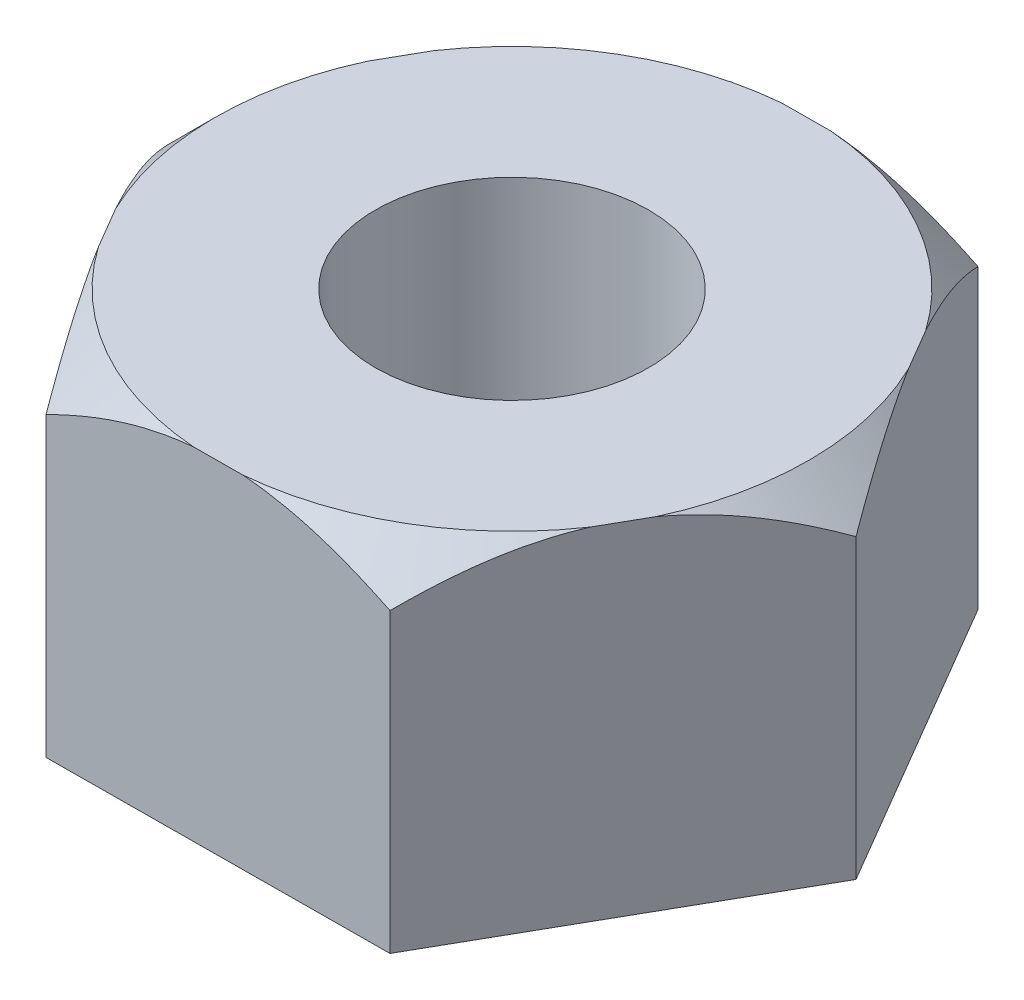
ISO-10303-21;
HEADER;
FILE_DESCRIPTION(('STEP AP214'),'2;1');
FILE_NAME('part.step','',(''),(''),'','','');
FILE_SCHEMA(('AUTOMOTIVE_DESIGN { 1 0 10303 214 1 1 1 1 }'));
ENDSEC;
DATA;
#1=APPLICATION_CONTEXT('core data for automotive mechanical design processes');
#2=APPLICATION_PROTOCOL_DEFINITION('international standard','automotive_design',2000,#1);
#3=PRODUCT_CONTEXT('',#1,'mechanical');
#4=PRODUCT('Part','Part','',(#3));
#5=PRODUCT_RELATED_PRODUCT_CATEGORY('part','',(#4));
#6=PRODUCT_DEFINITION_FORMATION('','',#4);
#7=PRODUCT_DEFINITION_CONTEXT('part definition',#1,'design');
#8=PRODUCT_DEFINITION('design','',#6,#7);
#9=PRODUCT_DEFINITION_SHAPE('','',#8);
#10=(LENGTH_UNIT() NAMED_UNIT(*) SI_UNIT(.MILLI.,.METRE.));
#11=(NAMED_UNIT(*) PLANE_ANGLE_UNIT() SI_UNIT($,.RADIAN.));
#12=(NAMED_UNIT(*) SI_UNIT($,.STERADIAN.) SOLID_ANGLE_UNIT());
#13=UNCERTAINTY_MEASURE_WITH_UNIT(LENGTH_MEASURE(1.E-05),#10,'distance_accuracy_value','');
#14=(GEOMETRIC_REPRESENTATION_CONTEXT(3) GLOBAL_UNCERTAINTY_ASSIGNED_CONTEXT((#13)) GLOBAL_UNIT_ASSIGNED_CONTEXT((#10,
#11,#12)) REPRESENTATION_CONTEXT('',''));
#15=CARTESIAN_POINT('',(0.,0.,0.));
#16=DIRECTION('',(0.,0.,1.));
#17=DIRECTION('',(1.,0.,0.));
#18=AXIS2_PLACEMENT_3D('',#15,#16,#17);
#19=CARTESIAN_POINT('',(0.,5.,0.));
#20=DIRECTION('',(0.,1.,0.));
#21=DIRECTION('',(0.,0.,1.));
#22=AXIS2_PLACEMENT_3D('',#19,#20,#21);
#23=PLANE('',#22);
#24=CARTESIAN_POINT('',(0.,5.,0.));
#25=DIRECTION('',(0.,1.,0.));
#26=DIRECTION('',(0.,0.,1.));
#27=AXIS2_PLACEMENT_3D('',#24,#25,#26);
#28=CIRCLE('',#27,2.);
#29=CARTESIAN_POINT('',(0.,5.,2.));
#30=VERTEX_POINT('',#29);
#31=EDGE_CURVE('E178',#30,#30,#28,.T.);
#32=ORIENTED_EDGE('',*,*,#31,.F.);
#33=EDGE_LOOP('',(#32));
#34=FACE_BOUND('',#33,.T.);
#35=DIRECTION('',(0.999978107754049,0.,-0.00661694889134233));
#36=VECTOR('',#35,1.);
#37=CARTESIAN_POINT('',(-2.47134714354739,5.,4.34666975330816));
#38=LINE('',#37,#36);
#39=CARTESIAN_POINT('',(-0.324990146446854,5.,4.33246710782796));
#40=VERTEX_POINT('',#39);
#41=CARTESIAN_POINT('',(0.382295859352073,5.,4.32778693001643));
#42=VERTEX_POINT('',#41);
#43=EDGE_CURVE('E146',#40,#42,#38,.T.);
#44=ORIENTED_EDGE('',*,*,#43,.T.);
#45=CARTESIAN_POINT('',(0.,5.,0.));
#46=DIRECTION('',(0.,1.,0.));
#47=DIRECTION('',(0.,0.,1.));
#48=AXIS2_PLACEMENT_3D('',#45,#46,#47);
#49=CIRCLE('',#48,4.34463920661989);
#50=CARTESIAN_POINT('',(3.58953150321608,5.,2.44768327671659));
#51=VERTEX_POINT('',#50);
#52=EDGE_CURVE('E131',#42,#51,#49,.T.);
#53=ORIENTED_EDGE('',*,*,#52,.T.);
#54=DIRECTION('',(0.494258608041579,0.,-0.869314918988971));
#55=VECTOR('',#54,1.);
#56=CARTESIAN_POINT('',(2.52865285645261,5.,4.31358428453623));
#57=LINE('',#56,#55);
#58=CARTESIAN_POINT('',(3.93912135323653,5.,1.83281553904771));
#59=VERTEX_POINT('',#58);
#60=EDGE_CURVE('E153',#51,#59,#57,.T.);
#61=ORIENTED_EDGE('',*,*,#60,.T.);
#62=CARTESIAN_POINT('',(3.91452164966294,5.,-1.88478383111138));
#63=VERTEX_POINT('',#62);
#64=EDGE_CURVE('E139',#59,#63,#49,.T.);
#65=ORIENTED_EDGE('',*,*,#64,.T.);
#66=DIRECTION('',(-0.50571949971247,0.,-0.862697970097628));
#67=VECTOR('',#66,1.);
#68=CARTESIAN_POINT('',(5.,5.,-0.0330854687719316));
#69=LINE('',#68,#67);
#70=CARTESIAN_POINT('',(3.55682549388446,5.,-2.49497139096871));
#71=VERTEX_POINT('',#70);
#72=EDGE_CURVE('E156',#63,#71,#69,.T.);
#73=ORIENTED_EDGE('',*,*,#72,.T.);
#74=CARTESIAN_POINT('',(0.324990146446878,5.,-4.33246710782796));
#75=VERTEX_POINT('',#74);
#76=EDGE_CURVE('E422',#71,#75,#49,.T.);
#77=ORIENTED_EDGE('',*,*,#76,.T.);
#78=DIRECTION('',(-0.999978107754049,0.,0.00661694889134233));
#79=VECTOR('',#78,1.);
#80=CARTESIAN_POINT('',(2.47134714354739,5.,-4.34666975330816));
#81=LINE('',#80,#79);
#82=CARTESIAN_POINT('',(-0.382295859352097,5.,-4.32778693001643));
#83=VERTEX_POINT('',#82);
#84=EDGE_CURVE('E166',#75,#83,#81,.T.);
#85=ORIENTED_EDGE('',*,*,#84,.T.);
#86=CARTESIAN_POINT('',(-3.58953150321606,5.,-2.44768327671662));
#87=VERTEX_POINT('',#86);
#88=EDGE_CURVE('E427',#83,#87,#49,.T.);
#89=ORIENTED_EDGE('',*,*,#88,.T.);
#90=DIRECTION('',(-0.494258608041579,0.,0.869314918988971));
#91=VECTOR('',#90,1.);
#92=CARTESIAN_POINT('',(-2.52865285645261,5.,-4.31358428453623));
#93=LINE('',#92,#91);
#94=CARTESIAN_POINT('',(-3.93912135323655,5.,-1.83281553904768));
#95=VERTEX_POINT('',#94);
#96=EDGE_CURVE('E169',#87,#95,#93,.T.);
#97=ORIENTED_EDGE('',*,*,#96,.T.);
#98=CARTESIAN_POINT('',(-3.91452164966295,5.,1.88478383111136));
#99=VERTEX_POINT('',#98);
#100=EDGE_CURVE('E431',#95,#99,#49,.T.);
#101=ORIENTED_EDGE('',*,*,#100,.T.);
#102=DIRECTION('',(0.50571949971247,0.,0.862697970097628));
#103=VECTOR('',#102,1.);
#104=CARTESIAN_POINT('',(-5.,5.,0.0330854687719312));
#105=LINE('',#104,#103);
#106=CARTESIAN_POINT('',(-3.55682549388444,5.,2.49497139096873));
#107=VERTEX_POINT('',#106);
#108=EDGE_CURVE('E172',#99,#107,#105,.T.);
#109=ORIENTED_EDGE('',*,*,#108,.T.);
#110=EDGE_CURVE('E141',#107,#40,#49,.T.);
#111=ORIENTED_EDGE('',*,*,#110,.T.);
#112=EDGE_LOOP('',(#44,#53,#61,#65,#73,#77,#85,#89,#97,#101,#109,#111));
#113=FACE_BOUND('',#112,.T.);
#114=ADVANCED_FACE('F38',(#34,#113),#23,.T.);
#115=CARTESIAN_POINT('',(-2.47134714354739,5.,4.34666975330816));
#116=DIRECTION('',(-0.00661694889134233,0.,-0.999978107754049));
#117=DIRECTION('',(-0.99997810775405,0.,0.00661694889134233));
#118=AXIS2_PLACEMENT_3D('',#115,#116,#117);
#119=PLANE('',#118);
#120=CARTESIAN_POINT('',(-2.47204714354739,4.34417969858305,4.34667438527379));
#121=CARTESIAN_POINT('',(-2.3860592991126,4.38717713174804,4.34610539564543));
#122=CARTESIAN_POINT('',(-2.29941043206587,4.4288553084804,4.34553203196847));
#123=CARTESIAN_POINT('',(-2.12466089074699,4.50917172835081,4.34437569787002));
#124=CARTESIAN_POINT('',(-2.0365594545984,4.54780831057605,4.34379272240713));
#125=CARTESIAN_POINT('',(-1.76906259243644,4.65888324950996,4.3420226705912));
#126=CARTESIAN_POINT('',(-1.58740219764143,4.72601265143189,4.34082060672739));
#127=CARTESIAN_POINT('',(-1.22106910310286,4.84096836799502,4.33839654629549));
#128=CARTESIAN_POINT('',(-1.03649011129652,4.88908440940011,4.33717516980162));
#129=CARTESIAN_POINT('',(-0.756585902561346,4.94474377625473,4.33532301741017));
#130=CARTESIAN_POINT('',(-0.662872276855587,4.96053699990727,4.33470290556281));
#131=CARTESIAN_POINT('',(-0.474651193440528,4.98626103131718,4.3334574290073));
#132=CARTESIAN_POINT('',(-0.380143856620473,4.99619271598547,4.33283206509909));
#133=CARTESIAN_POINT('',(-0.149869709892191,5.01284314701085,4.33130831948097));
#134=CARTESIAN_POINT('',(-0.0138548383188239,5.01633835366766,4.33040829632378));
#135=CARTESIAN_POINT('',(0.257930051112726,5.0104826537938,4.32860987022939));
#136=CARTESIAN_POINT('',(0.393699966405562,5.00112724296213,4.32771146797087));
#137=CARTESIAN_POINT('',(0.663960100809833,4.9701217742495,4.32592313132344));
#138=CARTESIAN_POINT('',(0.79844871619927,4.94845795691753,4.32503320754651));
#139=CARTESIAN_POINT('',(1.06511452691763,4.89401351447174,4.3232686548759));
#140=CARTESIAN_POINT('',(1.1972918985713,4.8612337413193,4.32239402481546));
#141=CARTESIAN_POINT('',(1.43198337860662,4.79377956373911,4.32084104928871));
#142=CARTESIAN_POINT('',(1.53501613119798,4.76087585671255,4.32015927190504));
#143=CARTESIAN_POINT('',(1.73923113548591,4.68976358572991,4.31880796207561));
#144=CARTESIAN_POINT('',(1.84041332987367,4.6515548577996,4.31813843000908));
#145=CARTESIAN_POINT('',(2.04060862344612,4.57068970077236,4.31681371898232));
#146=CARTESIAN_POINT('',(2.13962741741008,4.52804725384667,4.31615850233922));
#147=CARTESIAN_POINT('',(2.33583046751876,4.43887510636752,4.31486020836175));
#148=CARTESIAN_POINT('',(2.43301580693542,4.39234779531691,4.31421712385928));
#149=CARTESIAN_POINT('',(2.52935285645261,4.34417969858305,4.3135796525706));
#150=B_SPLINE_CURVE_WITH_KNOTS('',3,(#120,#121,#122,#123,#124,#125,#126,#127,#128,#129,#130,
#131,#132,#133,#134,#135,#136,#137,#138,#139,#140,#141,#142,#143,#144,#145,#146,#147,#148,#149),
.UNSPECIFIED.,.F.,.F.,(4,2,2,2,2,2,2,2,2,2,2,2,2,2,4),(0.,0.288404885729802,0.576966182751782,
1.15720621223807,1.72822790550571,2.01317834687957,2.29808614765337,2.70564017288363,
3.11333708731846,3.5214906615511,3.92961296069352,4.25394443535271,4.57828593708831,
4.90163395382304,5.22478453037687),.UNSPECIFIED.);
#151=CARTESIAN_POINT('',(-2.47134714354739,4.34452974299374,4.34666975330816));
#152=VERTEX_POINT('',#151);
#153=EDGE_CURVE('E138',#152,#40,#150,.T.);
#154=ORIENTED_EDGE('',*,*,#153,.F.);
#155=DIRECTION('',(0.,-1.,0.));
#156=VECTOR('',#155,1.);
#157=CARTESIAN_POINT('',(-2.47134714354739,5.,4.34666975330816));
#158=LINE('',#157,#156);
#159=CARTESIAN_POINT('',(-2.47134714354739,0.,4.34666975330816));
#160=VERTEX_POINT('',#159);
#161=EDGE_CURVE('E174',#152,#160,#158,.T.);
#162=ORIENTED_EDGE('',*,*,#161,.T.);
#163=DIRECTION('',(0.999978107754049,0.,-0.00661694889134233));
#164=VECTOR('',#163,1.);
#165=CARTESIAN_POINT('',(-2.47134714354739,0.,4.34666975330816));
#166=LINE('',#165,#164);
#167=CARTESIAN_POINT('',(2.52865285645261,0.,4.31358428453623));
#168=VERTEX_POINT('',#167);
#169=EDGE_CURVE('E175',#160,#168,#166,.T.);
#170=ORIENTED_EDGE('',*,*,#169,.T.);
#171=DIRECTION('',(0.,-1.,0.));
#172=VECTOR('',#171,1.);
#173=CARTESIAN_POINT('',(2.52865285645261,5.,4.31358428453623));
#174=LINE('',#173,#172);
#175=CARTESIAN_POINT('',(2.52865285645261,4.34452974299374,4.31358428453623));
#176=VERTEX_POINT('',#175);
#177=EDGE_CURVE('E148',#176,#168,#174,.T.);
#178=ORIENTED_EDGE('',*,*,#177,.F.);
#179=EDGE_CURVE('E60',#42,#176,#150,.T.);
#180=ORIENTED_EDGE('',*,*,#179,.F.);
#181=ORIENTED_EDGE('',*,*,#43,.F.);
#182=EDGE_LOOP('',(#154,#162,#170,#178,#180,#181));
#183=FACE_BOUND('',#182,.T.);
#184=ADVANCED_FACE('F40',(#183),#119,.F.);
#185=CARTESIAN_POINT('',(2.52865285645261,5.,4.31358428453623));
#186=DIRECTION('',(-0.869314918988971,0.,-0.494258608041579));
#187=DIRECTION('',(-0.494258608041579,0.,0.869314918988971));
#188=AXIS2_PLACEMENT_3D('',#185,#186,#187);
#189=PLANE('',#188);
#190=CARTESIAN_POINT('',(2.52825486371365,4.34412707847862,4.31428428453623));
#191=CARTESIAN_POINT('',(2.57075759485364,4.38712745430692,4.23952937349043));
#192=CARTESIAN_POINT('',(2.61358706897422,4.42880853630128,4.16419977837623));
#193=CARTESIAN_POINT('',(2.69996365214612,4.50913065924478,4.01227839313188));
#194=CARTESIAN_POINT('',(2.7435111378238,4.54777003909816,3.93568594058146));
#195=CARTESIAN_POINT('',(2.87573174212911,4.65885323152212,3.70313289638505));
#196=CARTESIAN_POINT('',(2.96552445513664,4.72598785599662,3.54520313296985));
#197=CARTESIAN_POINT('',(3.14659886714127,4.84095275881836,3.22672473878163));
#198=CARTESIAN_POINT('',(3.23783423990723,4.88907280969726,3.06625758779112));
#199=CARTESIAN_POINT('',(3.37618793779508,4.94473699650724,2.82291749878839));
#200=CARTESIAN_POINT('',(3.4225096070094,4.96053162594222,2.74144573994532));
#201=CARTESIAN_POINT('',(3.51554536243555,4.98625801290643,2.57781202901851));
#202=CARTESIAN_POINT('',(3.56225938887716,4.9961906475709,2.49565018206019));
#203=CARTESIAN_POINT('',(3.67607895207015,5.01284238488039,2.29546136845808));
#204=CARTESIAN_POINT('',(3.74330709560837,5.01633818417207,2.17721875780275));
#205=CARTESIAN_POINT('',(3.87764238696861,5.01048360092839,1.9409463469106));
#206=CARTESIAN_POINT('',(3.94474948410231,5.00112871382359,1.8229166358257));
#207=CARTESIAN_POINT('',(4.07833119293303,4.97012419310883,1.58796964552299));
#208=CARTESIAN_POINT('',(4.14480501186301,4.94846079791609,1.47105376064446));
#209=CARTESIAN_POINT('',(4.2766101925717,4.89401708858775,1.23923137429472));
#210=CARTESIAN_POINT('',(4.34194164149252,4.86123762633099,1.12432471955568));
#211=CARTESIAN_POINT('',(4.45794797475302,4.79378093139027,0.920289757776974));
#212=CARTESIAN_POINT('',(4.50887912112672,4.76087381065086,0.830710730394328));
#213=CARTESIAN_POINT('',(4.60982658310851,4.6897536663849,0.653161703817821));
#214=CARTESIAN_POINT('',(4.6598428702798,4.65154047824463,0.565191754639341));
#215=CARTESIAN_POINT('',(4.75880313579362,4.5706655834506,0.391137860992157));
#216=CARTESIAN_POINT('',(4.80774992927937,4.52801786058929,0.305048965176189));
#217=CARTESIAN_POINT('',(4.90473657541485,4.43883453074411,0.134466324719308));
#218=CARTESIAN_POINT('',(4.95277696383558,4.39230131472765,0.0499716377504016));
#219=CARTESIAN_POINT('',(5.00039799273896,4.34412707847862,-0.0337854687719309));
#220=B_SPLINE_CURVE_WITH_KNOTS('',3,(#190,#191,#192,#193,#194,#195,#196,#197,#198,#199,#200,
#201,#202,#203,#204,#205,#206,#207,#208,#209,#210,#211,#212,#213,#214,#215,#216,#217,#218,#219),
.UNSPECIFIED.,.F.,.F.,(4,2,2,2,2,2,2,2,2,2,2,2,2,2,4),(0.,0.28841734815559,0.576991125937133,
1.15725665464509,1.7283025266872,2.0132649569035,2.29818473713287,2.70573972143723,
3.11343760303238,3.52159221259774,3.92971555033495,4.25408019320967,4.57845490131693,
4.90183608673381,5.22501972326992),.UNSPECIFIED.);
#221=EDGE_CURVE('E133',#176,#51,#220,.T.);
#222=ORIENTED_EDGE('',*,*,#221,.F.);
#223=ORIENTED_EDGE('',*,*,#177,.T.);
#224=DIRECTION('',(0.494258608041579,0.,-0.869314918988971));
#225=VECTOR('',#224,1.);
#226=CARTESIAN_POINT('',(2.52865285645261,0.,4.31358428453623));
#227=LINE('',#226,#225);
#228=CARTESIAN_POINT('',(5.,0.,-0.0330854687719316));
#229=VERTEX_POINT('',#228);
#230=EDGE_CURVE('E177',#168,#229,#227,.T.);
#231=ORIENTED_EDGE('',*,*,#230,.T.);
#232=DIRECTION('',(0.,-1.,0.));
#233=VECTOR('',#232,1.);
#234=CARTESIAN_POINT('',(5.,5.,-0.0330854687719316));
#235=LINE('',#234,#233);
#236=CARTESIAN_POINT('',(5.,4.34452974299374,-0.0330854687719316));
#237=VERTEX_POINT('',#236);
#238=EDGE_CURVE('E196',#237,#229,#235,.T.);
#239=ORIENTED_EDGE('',*,*,#238,.F.);
#240=EDGE_CURVE('E68',#59,#237,#220,.T.);
#241=ORIENTED_EDGE('',*,*,#240,.F.);
#242=ORIENTED_EDGE('',*,*,#60,.F.);
#243=EDGE_LOOP('',(#222,#223,#231,#239,#241,#242));
#244=FACE_BOUND('',#243,.T.);
#245=ADVANCED_FACE('F218',(#244),#189,.F.);
#246=CARTESIAN_POINT('',(5.,5.,-0.0330854687719316));
#247=DIRECTION('',(-0.862697970097628,0.,0.50571949971247));
#248=DIRECTION('',(0.50571949971247,0.,0.862697970097628));
#249=AXIS2_PLACEMENT_3D('',#246,#247,#248);
#250=PLANE('',#249);
#251=CARTESIAN_POINT('',(5.00041034482759,4.34412398964012,-0.0323854687719316));
#252=CARTESIAN_POINT('',(4.95692196417132,4.3871245382075,-0.106571529891435));
#253=CARTESIAN_POINT('',(4.91309926281903,4.42880579074537,-0.181327902786519));
#254=CARTESIAN_POINT('',(4.82471958156804,4.5091282484682,-0.332093241391116));
#255=CARTESIAN_POINT('',(4.78016221630651,4.54776779254666,-0.408102864484308));
#256=CARTESIAN_POINT('',(4.64487536915204,4.65885146946321,-0.638886309630129));
#257=CARTESIAN_POINT('',(4.55300032629356,4.72598640050921,-0.795614323918105));
#258=CARTESIAN_POINT('',(4.36772672216016,4.84095184257511,-1.11166929567505));
#259=CARTESIAN_POINT('',(4.27437556188757,4.88907212881349,-1.27091539261061));
#260=CARTESIAN_POINT('',(4.13281337536912,4.9447365985558,-1.51240382843618));
#261=CARTESIAN_POINT('',(4.08541748366933,4.96053131050983,-1.59325564368874));
#262=CARTESIAN_POINT('',(3.99022418087904,4.98625783574275,-1.75564421903687));
#263=CARTESIAN_POINT('',(3.94242683094581,4.99619052617004,-1.83718087480531));
#264=CARTESIAN_POINT('',(3.82596788874042,5.01284234014965,-2.03584612915565));
#265=CARTESIAN_POINT('',(3.75718084682044,5.0163381742225,-2.15318873007797));
#266=CARTESIAN_POINT('',(3.61973056267019,5.01048365651128,-2.38766274421659));
#267=CARTESIAN_POINT('',(3.55106737230322,5.001128800142,-2.50479406896023));
#268=CARTESIAN_POINT('',(3.41438814135053,4.97012433505993,-2.73795275705596));
#269=CARTESIAN_POINT('',(3.34637291192033,4.94846096463923,-2.85397873667216));
#270=CARTESIAN_POINT('',(3.21151140113353,4.89401729832989,-3.08403660801432));
#271=CARTESIAN_POINT('',(3.14466503061475,4.86123785431526,-3.19806865184046));
#272=CARTESIAN_POINT('',(3.02596840618762,4.79378101160134,-3.40055112880436));
#273=CARTESIAN_POINT('',(2.97385595331124,4.76087369047952,-3.48944884253466));
#274=CARTESIAN_POINT('',(2.87056710255879,4.6897530840566,-3.66564747028881));
#275=CARTESIAN_POINT('',(2.81939073378558,4.65153963410423,-3.75294833466663));
#276=CARTESIAN_POINT('',(2.71813518130969,4.57066416770818,-3.92567839477253));
#277=CARTESIAN_POINT('',(2.66805311716282,4.52801613515209,-4.01111250419953));
#278=CARTESIAN_POINT('',(2.56881697099556,4.43883214890841,-4.18039769472012));
#279=CARTESIAN_POINT('',(2.5196623407601,4.3922985862742,-4.26424971100414));
#280=CARTESIAN_POINT('',(2.47093679871981,4.34412398964012,-4.34736975330816));
#281=B_SPLINE_CURVE_WITH_KNOTS('',3,(#251,#252,#253,#254,#255,#256,#257,#258,#259,#260,#261,
#262,#263,#264,#265,#266,#267,#268,#269,#270,#271,#272,#273,#274,#275,#276,#277,#278,#279,#280),
.UNSPECIFIED.,.F.,.F.,(4,2,2,2,2,2,2,2,2,2,2,2,2,2,4),(0.,0.288418079725537,0.576992590153295,
1.15725961571958,1.72830690710289,2.01327004108727,2.29819052453367,2.70574556514956,
3.11344350353103,3.52159817388431,3.92972157260084,4.25408816238239,4.57846481963663,
4.9018479519892,5.2250335290795),.UNSPECIFIED.);
#282=EDGE_CURVE('E223',#237,#63,#281,.T.);
#283=ORIENTED_EDGE('',*,*,#282,.F.);
#284=ORIENTED_EDGE('',*,*,#238,.T.);
#285=DIRECTION('',(-0.50571949971247,0.,-0.862697970097628));
#286=VECTOR('',#285,1.);
#287=CARTESIAN_POINT('',(5.,0.,-0.0330854687719316));
#288=LINE('',#287,#286);
#289=CARTESIAN_POINT('',(2.47134714354739,0.,-4.34666975330816));
#290=VERTEX_POINT('',#289);
#291=EDGE_CURVE('E181',#229,#290,#288,.T.);
#292=ORIENTED_EDGE('',*,*,#291,.T.);
#293=DIRECTION('',(0.,-1.,0.));
#294=VECTOR('',#293,1.);
#295=CARTESIAN_POINT('',(2.47134714354739,5.,-4.34666975330816));
#296=LINE('',#295,#294);
#297=CARTESIAN_POINT('',(2.47134714354739,4.34452974299374,-4.34666975330816));
#298=VERTEX_POINT('',#297);
#299=EDGE_CURVE('E194',#298,#290,#296,.T.);
#300=ORIENTED_EDGE('',*,*,#299,.F.);
#301=EDGE_CURVE('E226',#71,#298,#281,.T.);
#302=ORIENTED_EDGE('',*,*,#301,.F.);
#303=ORIENTED_EDGE('',*,*,#72,.F.);
#304=EDGE_LOOP('',(#283,#284,#292,#300,#302,#303));
#305=FACE_BOUND('',#304,.T.);
#306=ADVANCED_FACE('F220',(#305),#250,.F.);
#307=CARTESIAN_POINT('',(2.47134714354739,5.,-4.34666975330816));
#308=DIRECTION('',(0.00661694889134233,0.,0.99997810775405));
#309=DIRECTION('',(0.99997810775405,0.,-0.00661694889134233));
#310=AXIS2_PLACEMENT_3D('',#307,#308,#309);
#311=PLANE('',#310);
#312=CARTESIAN_POINT('',(2.47204714354739,4.34417969858305,-4.34667438527379));
#313=CARTESIAN_POINT('',(2.3860592991126,4.38717713174804,-4.34610539564542));
#314=CARTESIAN_POINT('',(2.29941043206588,4.4288553084804,-4.34553203196846));
#315=CARTESIAN_POINT('',(2.124660890747,4.50917172835081,-4.34437569787002));
#316=CARTESIAN_POINT('',(2.0365594545984,4.54780831057605,-4.34379272240713));
#317=CARTESIAN_POINT('',(1.76906259243645,4.65888324950996,-4.3420226705912));
#318=CARTESIAN_POINT('',(1.58740219764144,4.72601265143189,-4.34082060672738));
#319=CARTESIAN_POINT('',(1.22106910310286,4.84096836799502,-4.33839654629549));
#320=CARTESIAN_POINT('',(1.03649011129652,4.88908440940011,-4.33717516980161));
#321=CARTESIAN_POINT('',(0.756585902561347,4.94474377625473,-4.33532301741017));
#322=CARTESIAN_POINT('',(0.662872276855588,4.96053699990728,-4.33470290556281));
#323=CARTESIAN_POINT('',(0.47465119344053,4.98626103131718,-4.3334574290073));
#324=CARTESIAN_POINT('',(0.380143856620475,4.99619271598547,-4.33283206509908));
#325=CARTESIAN_POINT('',(0.149869709892193,5.01284314701085,-4.33130831948097));
#326=CARTESIAN_POINT('',(0.0138548383188254,5.01633835366767,-4.33040829632378));
#327=CARTESIAN_POINT('',(-0.257930051112725,5.0104826537938,-4.32860987022938));
#328=CARTESIAN_POINT('',(-0.39369996640556,5.00112724296213,-4.32771146797087));
#329=CARTESIAN_POINT('',(-0.663960100809832,4.9701217742495,-4.32592313132344));
#330=CARTESIAN_POINT('',(-0.798448716199268,4.94845795691753,-4.32503320754651));
#331=CARTESIAN_POINT('',(-1.06511452691763,4.89401351447174,-4.3232686548759));
#332=CARTESIAN_POINT('',(-1.1972918985713,4.8612337413193,-4.32239402481546));
#333=CARTESIAN_POINT('',(-1.43198337860662,4.79377956373911,-4.32084104928871));
#334=CARTESIAN_POINT('',(-1.53501613119797,4.76087585671255,-4.32015927190504));
#335=CARTESIAN_POINT('',(-1.73923113548591,4.68976358572991,-4.31880796207561));
#336=CARTESIAN_POINT('',(-1.84041332987367,4.65155485779961,-4.31813843000907));
#337=CARTESIAN_POINT('',(-2.04060862344612,4.57068970077237,-4.31681371898232));
#338=CARTESIAN_POINT('',(-2.13962741741008,4.52804725384667,-4.31615850233921));
#339=CARTESIAN_POINT('',(-2.33583046751876,4.43887510636752,-4.31486020836175));
#340=CARTESIAN_POINT('',(-2.43301580693542,4.39234779531691,-4.31421712385928));
#341=CARTESIAN_POINT('',(-2.52935285645261,4.34417969858305,-4.3135796525706));
#342=B_SPLINE_CURVE_WITH_KNOTS('',3,(#312,#313,#314,#315,#316,#317,#318,#319,#320,#321,#322,
#323,#324,#325,#326,#327,#328,#329,#330,#331,#332,#333,#334,#335,#336,#337,#338,#339,#340,#341),
.UNSPECIFIED.,.F.,.F.,(4,2,2,2,2,2,2,2,2,2,2,2,2,2,4),(0.,0.288404885729802,0.576966182751784,
1.15720621223807,1.72822790550571,2.01317834687958,2.29808614765338,2.70564017288363,
3.11333708731847,3.5214906615511,3.92961296069352,4.25394443535271,4.57828593708831,
4.90163395382304,5.22478453037687),.UNSPECIFIED.);
#343=EDGE_CURVE('E229',#298,#75,#342,.T.);
#344=ORIENTED_EDGE('',*,*,#343,.F.);
#345=ORIENTED_EDGE('',*,*,#299,.T.);
#346=DIRECTION('',(-0.999978107754049,0.,0.00661694889134233));
#347=VECTOR('',#346,1.);
#348=CARTESIAN_POINT('',(2.47134714354739,0.,-4.34666975330816));
#349=LINE('',#348,#347);
#350=CARTESIAN_POINT('',(-2.52865285645261,0.,-4.31358428453623));
#351=VERTEX_POINT('',#350);
#352=EDGE_CURVE('E184',#290,#351,#349,.T.);
#353=ORIENTED_EDGE('',*,*,#352,.T.);
#354=DIRECTION('',(0.,-1.,0.));
#355=VECTOR('',#354,1.);
#356=CARTESIAN_POINT('',(-2.52865285645261,5.,-4.31358428453623));
#357=LINE('',#356,#355);
#358=CARTESIAN_POINT('',(-2.52865285645261,4.34452974299374,-4.31358428453623));
#359=VERTEX_POINT('',#358);
#360=EDGE_CURVE('E192',#359,#351,#357,.T.);
#361=ORIENTED_EDGE('',*,*,#360,.F.);
#362=EDGE_CURVE('E236',#83,#359,#342,.T.);
#363=ORIENTED_EDGE('',*,*,#362,.F.);
#364=ORIENTED_EDGE('',*,*,#84,.F.);
#365=EDGE_LOOP('',(#344,#345,#353,#361,#363,#364));
#366=FACE_BOUND('',#365,.T.);
#367=ADVANCED_FACE('F272',(#366),#311,.F.);
#368=CARTESIAN_POINT('',(-2.52865285645261,5.,-4.31358428453623));
#369=DIRECTION('',(0.869314918988971,0.,0.494258608041579));
#370=DIRECTION('',(0.494258608041579,0.,-0.869314918988971));
#371=AXIS2_PLACEMENT_3D('',#368,#369,#370);
#372=PLANE('',#371);
#373=CARTESIAN_POINT('',(-2.52825486371365,4.34412707847862,-4.31428428453623));
#374=CARTESIAN_POINT('',(-2.57075759485364,4.38712745430692,-4.23952937349043));
#375=CARTESIAN_POINT('',(-2.61358706897422,4.42880853630128,-4.16419977837623));
#376=CARTESIAN_POINT('',(-2.69996365214612,4.50913065924479,-4.01227839313188));
#377=CARTESIAN_POINT('',(-2.74351113782379,4.54777003909816,-3.93568594058146));
#378=CARTESIAN_POINT('',(-2.87573174212911,4.65885323152213,-3.70313289638505));
#379=CARTESIAN_POINT('',(-2.96552445513663,4.72598785599662,-3.54520313296985));
#380=CARTESIAN_POINT('',(-3.14659886714127,4.84095275881836,-3.22672473878163));
#381=CARTESIAN_POINT('',(-3.23783423990723,4.88907280969726,-3.06625758779112));
#382=CARTESIAN_POINT('',(-3.37618793779508,4.94473699650725,-2.82291749878839));
#383=CARTESIAN_POINT('',(-3.42250960700939,4.96053162594222,-2.74144573994532));
#384=CARTESIAN_POINT('',(-3.51554536243555,4.98625801290644,-2.57781202901851));
#385=CARTESIAN_POINT('',(-3.56225938887716,4.9961906475709,-2.49565018206019));
#386=CARTESIAN_POINT('',(-3.67607895207015,5.01284238488039,-2.29546136845808));
#387=CARTESIAN_POINT('',(-3.74330709560837,5.01633818417207,-2.17721875780275));
#388=CARTESIAN_POINT('',(-3.87764238696861,5.01048360092839,-1.9409463469106));
#389=CARTESIAN_POINT('',(-3.94474948410231,5.00112871382359,-1.8229166358257));
#390=CARTESIAN_POINT('',(-4.07833119293302,4.97012419310883,-1.58796964552299));
#391=CARTESIAN_POINT('',(-4.14480501186301,4.9484607979161,-1.47105376064446));
#392=CARTESIAN_POINT('',(-4.2766101925717,4.89401708858775,-1.23923137429472));
#393=CARTESIAN_POINT('',(-4.34194164149252,4.861237626331,-1.12432471955568));
#394=CARTESIAN_POINT('',(-4.45794797475302,4.79378093139027,-0.920289757776975));
#395=CARTESIAN_POINT('',(-4.50887912112671,4.76087381065086,-0.830710730394329));
#396=CARTESIAN_POINT('',(-4.6098265831085,4.6897536663849,-0.653161703817822));
#397=CARTESIAN_POINT('',(-4.6598428702798,4.65154047824463,-0.565191754639342));
#398=CARTESIAN_POINT('',(-4.75880313579362,4.5706655834506,-0.391137860992158));
#399=CARTESIAN_POINT('',(-4.80774992927937,4.5280178605893,-0.305048965176191));
#400=CARTESIAN_POINT('',(-4.90473657541485,4.43883453074412,-0.134466324719309));
#401=CARTESIAN_POINT('',(-4.95277696383558,4.39230131472765,-0.0499716377504023));
#402=CARTESIAN_POINT('',(-5.00039799273896,4.34412707847862,0.033785468771931));
#403=B_SPLINE_CURVE_WITH_KNOTS('',3,(#373,#374,#375,#376,#377,#378,#379,#380,#381,#382,#383,
#384,#385,#386,#387,#388,#389,#390,#391,#392,#393,#394,#395,#396,#397,#398,#399,#400,#401,#402),
.UNSPECIFIED.,.F.,.F.,(4,2,2,2,2,2,2,2,2,2,2,2,2,2,4),(0.,0.28841734815559,0.576991125937133,
1.15725665464509,1.7283025266872,2.0132649569035,2.29818473713287,2.70573972143723,
3.11343760303238,3.52159221259774,3.92971555033495,4.25408019320967,4.57845490131692,
4.90183608673381,5.22501972326992),.UNSPECIFIED.);
#404=EDGE_CURVE('E268',#359,#87,#403,.T.);
#405=ORIENTED_EDGE('',*,*,#404,.F.);
#406=ORIENTED_EDGE('',*,*,#360,.T.);
#407=DIRECTION('',(-0.494258608041579,0.,0.869314918988971));
#408=VECTOR('',#407,1.);
#409=CARTESIAN_POINT('',(-2.52865285645261,0.,-4.31358428453623));
#410=LINE('',#409,#408);
#411=CARTESIAN_POINT('',(-5.,0.,0.0330854687719312));
#412=VERTEX_POINT('',#411);
#413=EDGE_CURVE('E159',#351,#412,#410,.T.);
#414=ORIENTED_EDGE('',*,*,#413,.T.);
#415=DIRECTION('',(0.,-1.,0.));
#416=VECTOR('',#415,1.);
#417=CARTESIAN_POINT('',(-5.,5.,0.0330854687719312));
#418=LINE('',#417,#416);
#419=CARTESIAN_POINT('',(-5.,4.34452974299374,0.0330854687719312));
#420=VERTEX_POINT('',#419);
#421=EDGE_CURVE('E190',#420,#412,#418,.T.);
#422=ORIENTED_EDGE('',*,*,#421,.F.);
#423=EDGE_CURVE('E205',#95,#420,#403,.T.);
#424=ORIENTED_EDGE('',*,*,#423,.F.);
#425=ORIENTED_EDGE('',*,*,#96,.F.);
#426=EDGE_LOOP('',(#405,#406,#414,#422,#424,#425));
#427=FACE_BOUND('',#426,.T.);
#428=ADVANCED_FACE('F269',(#427),#372,.F.);
#429=CARTESIAN_POINT('',(-5.,5.,0.0330854687719312));
#430=DIRECTION('',(0.862697970097629,0.,-0.50571949971247));
#431=DIRECTION('',(-0.50571949971247,0.,-0.862697970097629));
#432=AXIS2_PLACEMENT_3D('',#429,#430,#431);
#433=PLANE('',#432);
#434=CARTESIAN_POINT('',(-5.00041034482758,4.34412398964012,0.0323854687719313));
#435=CARTESIAN_POINT('',(-4.95692196417132,4.3871245382075,0.106571529891434));
#436=CARTESIAN_POINT('',(-4.91309926281902,4.42880579074537,0.181327902786518));
#437=CARTESIAN_POINT('',(-4.82471958156804,4.5091282484682,0.332093241391116));
#438=CARTESIAN_POINT('',(-4.78016221630651,4.54776779254666,0.408102864484308));
#439=CARTESIAN_POINT('',(-4.64487536915204,4.65885146946321,0.63888630963013));
#440=CARTESIAN_POINT('',(-4.55300032629356,4.72598640050921,0.795614323918106));
#441=CARTESIAN_POINT('',(-4.36772672216015,4.84095184257512,1.11166929567505));
#442=CARTESIAN_POINT('',(-4.27437556188757,4.88907212881349,1.27091539261061));
#443=CARTESIAN_POINT('',(-4.13281337536912,4.94473659855581,1.51240382843618));
#444=CARTESIAN_POINT('',(-4.08541748366933,4.96053131050984,1.59325564368875));
#445=CARTESIAN_POINT('',(-3.99022418087904,4.98625783574275,1.75564421903687));
#446=CARTESIAN_POINT('',(-3.94242683094581,4.99619052617004,1.83718087480531));
#447=CARTESIAN_POINT('',(-3.82596788874042,5.01284234014965,2.03584612915565));
#448=CARTESIAN_POINT('',(-3.75718084682043,5.0163381742225,2.15318873007797));
#449=CARTESIAN_POINT('',(-3.61973056267019,5.01048365651128,2.38766274421659));
#450=CARTESIAN_POINT('',(-3.55106737230322,5.001128800142,2.50479406896023));
#451=CARTESIAN_POINT('',(-3.41438814135053,4.97012433505994,2.73795275705596));
#452=CARTESIAN_POINT('',(-3.34637291192033,4.94846096463924,2.85397873667216));
#453=CARTESIAN_POINT('',(-3.21151140113353,4.89401729832989,3.08403660801432));
#454=CARTESIAN_POINT('',(-3.14466503061475,4.86123785431526,3.19806865184046));
#455=CARTESIAN_POINT('',(-3.02596840618762,4.79378101160134,3.40055112880436));
#456=CARTESIAN_POINT('',(-2.97385595331123,4.76087369047952,3.48944884253466));
#457=CARTESIAN_POINT('',(-2.87056710255879,4.6897530840566,3.66564747028881));
#458=CARTESIAN_POINT('',(-2.81939073378557,4.65153963410423,3.75294833466663));
#459=CARTESIAN_POINT('',(-2.71813518130969,4.57066416770818,3.92567839477253));
#460=CARTESIAN_POINT('',(-2.66805311716282,4.52801613515209,4.01111250419953));
#461=CARTESIAN_POINT('',(-2.56881697099556,4.43883214890841,4.18039769472012));
#462=CARTESIAN_POINT('',(-2.5196623407601,4.3922985862742,4.26424971100414));
#463=CARTESIAN_POINT('',(-2.4709367987198,4.34412398964012,4.34736975330816));
#464=B_SPLINE_CURVE_WITH_KNOTS('',3,(#434,#435,#436,#437,#438,#439,#440,#441,#442,#443,#444,
#445,#446,#447,#448,#449,#450,#451,#452,#453,#454,#455,#456,#457,#458,#459,#460,#461,#462,#463),
.UNSPECIFIED.,.F.,.F.,(4,2,2,2,2,2,2,2,2,2,2,2,2,2,4),(0.,0.288418079725537,0.576992590153296,
1.15725961571958,1.72830690710289,2.01327004108727,2.29819052453367,2.70574556514956,
3.11344350353103,3.52159817388432,3.92972157260084,4.25408816238239,4.57846481963663,
4.9018479519892,5.2250335290795),.UNSPECIFIED.);
#465=EDGE_CURVE('E12',#420,#99,#464,.T.);
#466=ORIENTED_EDGE('',*,*,#465,.F.);
#467=ORIENTED_EDGE('',*,*,#421,.T.);
#468=DIRECTION('',(0.50571949971247,0.,0.862697970097628));
#469=VECTOR('',#468,1.);
#470=CARTESIAN_POINT('',(-5.,0.,0.0330854687719312));
#471=LINE('',#470,#469);
#472=EDGE_CURVE('E154',#412,#160,#471,.T.);
#473=ORIENTED_EDGE('',*,*,#472,.T.);
#474=ORIENTED_EDGE('',*,*,#161,.F.);
#475=EDGE_CURVE('E43',#107,#152,#464,.T.);
#476=ORIENTED_EDGE('',*,*,#475,.F.);
#477=ORIENTED_EDGE('',*,*,#108,.F.);
#478=EDGE_LOOP('',(#466,#467,#473,#474,#476,#477));
#479=FACE_BOUND('',#478,.T.);
#480=ADVANCED_FACE('F207',(#479),#433,.F.);
#481=CARTESIAN_POINT('',(0.,0.,0.));
#482=DIRECTION('',(0.,1.,0.));
#483=DIRECTION('',(0.,0.,1.));
#484=AXIS2_PLACEMENT_3D('',#481,#482,#483);
#485=PLANE('',#484);
#486=ORIENTED_EDGE('',*,*,#169,.F.);
#487=ORIENTED_EDGE('',*,*,#472,.F.);
#488=ORIENTED_EDGE('',*,*,#413,.F.);
#489=ORIENTED_EDGE('',*,*,#352,.F.);
#490=ORIENTED_EDGE('',*,*,#291,.F.);
#491=ORIENTED_EDGE('',*,*,#230,.F.);
#492=EDGE_LOOP('',(#486,#487,#488,#489,#490,#491));
#493=FACE_BOUND('',#492,.T.);
#494=CARTESIAN_POINT('',(0.,0.,0.));
#495=DIRECTION('',(0.,1.,0.));
#496=DIRECTION('',(0.,0.,1.));
#497=AXIS2_PLACEMENT_3D('',#494,#495,#496);
#498=CIRCLE('',#497,2.);
#499=CARTESIAN_POINT('',(0.,0.,2.));
#500=VERTEX_POINT('',#499);
#501=EDGE_CURVE('E149',#500,#500,#498,.T.);
#502=ORIENTED_EDGE('',*,*,#501,.T.);
#503=EDGE_LOOP('',(#502));
#504=FACE_BOUND('',#503,.T.);
#505=ADVANCED_FACE('F213',(#493,#504),#485,.F.);
#506=CARTESIAN_POINT('',(0.,5.,0.));
#507=DIRECTION('',(0.,-1.,0.));
#508=DIRECTION('',(0.,0.,-1.));
#509=AXIS2_PLACEMENT_3D('',#506,#507,#508);
#510=CYLINDRICAL_SURFACE('',#509,2.);
#511=ORIENTED_EDGE('',*,*,#31,.T.);
#512=EDGE_LOOP('',(#511));
#513=FACE_BOUND('',#512,.T.);
#514=ORIENTED_EDGE('',*,*,#501,.F.);
#515=EDGE_LOOP('',(#514));
#516=FACE_BOUND('',#515,.T.);
#517=ADVANCED_FACE('F252',(#513,#516),#510,.F.);
#518=CARTESIAN_POINT('',(0.,5.,0.));
#519=DIRECTION('',(0.,-1.,0.));
#520=DIRECTION('',(0.,0.,1.));
#521=AXIS2_PLACEMENT_3D('',#518,#519,#520);
#522=CONICAL_SURFACE('',#521,4.34463920661989,0.78539816339745);
#523=ORIENTED_EDGE('',*,*,#153,.T.);
#524=ORIENTED_EDGE('',*,*,#110,.F.);
#525=ORIENTED_EDGE('',*,*,#475,.T.);
#526=EDGE_LOOP('',(#523,#524,#525));
#527=FACE_BOUND('',#526,.T.);
#528=ADVANCED_FACE('F201',(#527),#522,.T.);
#529=ORIENTED_EDGE('',*,*,#423,.T.);
#530=ORIENTED_EDGE('',*,*,#465,.T.);
#531=ORIENTED_EDGE('',*,*,#100,.F.);
#532=EDGE_LOOP('',(#529,#530,#531));
#533=FACE_BOUND('',#532,.T.);
#534=ADVANCED_FACE('F368',(#533),#522,.T.);
#535=ORIENTED_EDGE('',*,*,#362,.T.);
#536=ORIENTED_EDGE('',*,*,#404,.T.);
#537=ORIENTED_EDGE('',*,*,#88,.F.);
#538=EDGE_LOOP('',(#535,#536,#537));
#539=FACE_BOUND('',#538,.T.);
#540=ADVANCED_FACE('F375',(#539),#522,.T.);
#541=ORIENTED_EDGE('',*,*,#301,.T.);
#542=ORIENTED_EDGE('',*,*,#343,.T.);
#543=ORIENTED_EDGE('',*,*,#76,.F.);
#544=EDGE_LOOP('',(#541,#542,#543));
#545=FACE_BOUND('',#544,.T.);
#546=ADVANCED_FACE('F384',(#545),#522,.T.);
#547=ORIENTED_EDGE('',*,*,#240,.T.);
#548=ORIENTED_EDGE('',*,*,#282,.T.);
#549=ORIENTED_EDGE('',*,*,#64,.F.);
#550=EDGE_LOOP('',(#547,#548,#549));
#551=FACE_BOUND('',#550,.T.);
#552=ADVANCED_FACE('F251',(#551),#522,.T.);
#553=ORIENTED_EDGE('',*,*,#179,.T.);
#554=ORIENTED_EDGE('',*,*,#221,.T.);
#555=ORIENTED_EDGE('',*,*,#52,.F.);
#556=EDGE_LOOP('',(#553,#554,#555));
#557=FACE_BOUND('',#556,.T.);
#558=ADVANCED_FACE('F132',(#557),#522,.T.);
#559=CLOSED_SHELL('',(#114,#184,#245,#306,#367,#428,#480,#505,#517,#528,#534,#540,#546,#552,#558));
#560=MANIFOLD_SOLID_BREP('B2',#559);
#561=ADVANCED_BREP_SHAPE_REPRESENTATION('',(#18,#560),#14);
#562=SHAPE_DEFINITION_REPRESENTATION(#9,#561);
ENDSEC;
END-ISO-10303-21;
